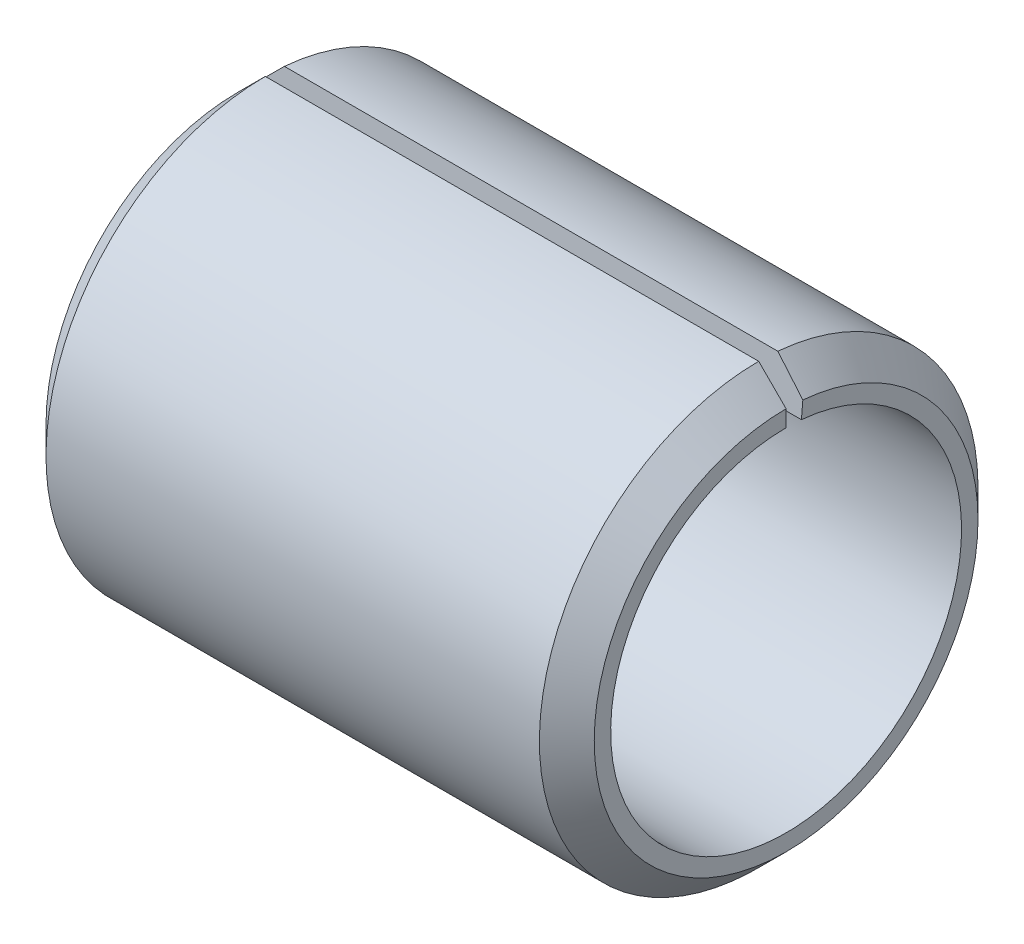
ISO-10303-21;
HEADER;
FILE_DESCRIPTION(('STEP AP214'),'2;1');
FILE_NAME('part.step','',(''),(''),'','','');
FILE_SCHEMA(('AUTOMOTIVE_DESIGN { 1 0 10303 214 1 1 1 1 }'));
ENDSEC;
DATA;
#1=APPLICATION_CONTEXT('core data for automotive mechanical design processes');
#2=APPLICATION_PROTOCOL_DEFINITION('international standard','automotive_design',2000,#1);
#3=PRODUCT_CONTEXT('',#1,'mechanical');
#4=PRODUCT('Part','Part','',(#3));
#5=PRODUCT_RELATED_PRODUCT_CATEGORY('part','',(#4));
#6=PRODUCT_DEFINITION_FORMATION('','',#4);
#7=PRODUCT_DEFINITION_CONTEXT('part definition',#1,'design');
#8=PRODUCT_DEFINITION('design','',#6,#7);
#9=PRODUCT_DEFINITION_SHAPE('','',#8);
#10=(LENGTH_UNIT() NAMED_UNIT(*) SI_UNIT(.MILLI.,.METRE.));
#11=(NAMED_UNIT(*) PLANE_ANGLE_UNIT() SI_UNIT($,.RADIAN.));
#12=(NAMED_UNIT(*) SI_UNIT($,.STERADIAN.) SOLID_ANGLE_UNIT());
#13=UNCERTAINTY_MEASURE_WITH_UNIT(LENGTH_MEASURE(1.E-05),#10,'distance_accuracy_value','');
#14=(GEOMETRIC_REPRESENTATION_CONTEXT(3) GLOBAL_UNCERTAINTY_ASSIGNED_CONTEXT((#13)) GLOBAL_UNIT_ASSIGNED_CONTEXT((#10,
#11,#12)) REPRESENTATION_CONTEXT('',''));
#15=CARTESIAN_POINT('',(0.,0.,0.));
#16=DIRECTION('',(0.,0.,1.));
#17=DIRECTION('',(1.,0.,0.));
#18=AXIS2_PLACEMENT_3D('',#15,#16,#17);
#19=CARTESIAN_POINT('',(-7.53134107515052,0.,0.));
#20=DIRECTION('',(-1.,0.,0.));
#21=DIRECTION('',(0.,0.,1.));
#22=AXIS2_PLACEMENT_3D('',#19,#20,#21);
#23=CYLINDRICAL_SURFACE('',#22,3.2);
#24=CARTESIAN_POINT('',(-5.,0.,0.));
#25=DIRECTION('',(-1.,0.,0.));
#26=DIRECTION('',(0.,0.,1.));
#27=AXIS2_PLACEMENT_3D('',#24,#25,#26);
#28=CIRCLE('',#27,3.2);
#29=CARTESIAN_POINT('',(-5.,3.18782303389359,-0.278898376792464));
#30=VERTEX_POINT('',#29);
#31=CARTESIAN_POINT('',(-5.,3.2,0.));
#32=VERTEX_POINT('',#31);
#33=EDGE_CURVE('E92',#30,#32,#28,.T.);
#34=ORIENTED_EDGE('',*,*,#33,.T.);
#35=DIRECTION('',(1.,0.,0.));
#36=VECTOR('',#35,1.);
#37=CARTESIAN_POINT('',(-5.,3.2,0.));
#38=LINE('',#37,#36);
#39=CARTESIAN_POINT('',(5.,3.2,0.));
#40=VERTEX_POINT('',#39);
#41=EDGE_CURVE('E99',#32,#40,#38,.T.);
#42=ORIENTED_EDGE('',*,*,#41,.T.);
#43=CARTESIAN_POINT('',(5.,0.,0.));
#44=DIRECTION('',(-1.,0.,0.));
#45=DIRECTION('',(0.,0.,1.));
#46=AXIS2_PLACEMENT_3D('',#43,#44,#45);
#47=CIRCLE('',#46,3.2);
#48=CARTESIAN_POINT('',(5.,3.18782303389359,-0.278898376792464));
#49=VERTEX_POINT('',#48);
#50=EDGE_CURVE('E83',#49,#40,#47,.T.);
#51=ORIENTED_EDGE('',*,*,#50,.F.);
#52=DIRECTION('',(1.,0.,0.));
#53=VECTOR('',#52,1.);
#54=CARTESIAN_POINT('',(-5.,3.18782303389359,-0.278898376792464));
#55=LINE('',#54,#53);
#56=EDGE_CURVE('E111',#30,#49,#55,.T.);
#57=ORIENTED_EDGE('',*,*,#56,.F.);
#58=EDGE_LOOP('',(#34,#42,#51,#57));
#59=FACE_BOUND('',#58,.T.);
#60=ADVANCED_FACE('F31',(#59),#23,.F.);
#61=CARTESIAN_POINT('',(-5.,3.18782303389359,-0.278898376792464));
#62=DIRECTION('',(1.,0.,0.));
#63=DIRECTION('',(0.,0.,-1.));
#64=AXIS2_PLACEMENT_3D('',#61,#62,#63);
#65=PLANE('',#64);
#66=DIRECTION('',(0.,-0.996194698091747,0.087155742747645));
#67=VECTOR('',#66,1.);
#68=CARTESIAN_POINT('',(-5.,3.18782303389359,-0.278898376792464));
#69=LINE('',#68,#67);
#70=CARTESIAN_POINT('',(-5.,3.48668144332112,-0.305045099616758));
#71=VERTEX_POINT('',#70);
#72=EDGE_CURVE('E93',#71,#30,#69,.T.);
#73=ORIENTED_EDGE('',*,*,#72,.F.);
#74=CARTESIAN_POINT('',(-5.,0.,0.));
#75=DIRECTION('',(1.,0.,0.));
#76=DIRECTION('',(0.,0.,-1.));
#77=AXIS2_PLACEMENT_3D('',#74,#75,#76);
#78=CIRCLE('',#77,3.5);
#79=CARTESIAN_POINT('',(-5.,3.5,0.));
#80=VERTEX_POINT('',#79);
#81=EDGE_CURVE('E118',#71,#80,#78,.F.);
#82=ORIENTED_EDGE('',*,*,#81,.T.);
#83=DIRECTION('',(0.,-1.,0.));
#84=VECTOR('',#83,1.);
#85=CARTESIAN_POINT('',(-5.,3.2,0.));
#86=LINE('',#85,#84);
#87=EDGE_CURVE('E109',#80,#32,#86,.T.);
#88=ORIENTED_EDGE('',*,*,#87,.T.);
#89=ORIENTED_EDGE('',*,*,#33,.F.);
#90=EDGE_LOOP('',(#73,#82,#88,#89));
#91=FACE_BOUND('',#90,.T.);
#92=ADVANCED_FACE('F136',(#91),#65,.F.);
#93=CARTESIAN_POINT('',(-7.53134107515052,0.,0.));
#94=DIRECTION('',(-1.,0.,0.));
#95=DIRECTION('',(0.,0.,1.));
#96=AXIS2_PLACEMENT_3D('',#93,#94,#95);
#97=CYLINDRICAL_SURFACE('',#96,4.);
#98=DIRECTION('',(-1.,0.,0.));
#99=VECTOR('',#98,1.);
#100=CARTESIAN_POINT('',(-5.,4.,0.));
#101=LINE('',#100,#99);
#102=CARTESIAN_POINT('',(4.5,4.,0.));
#103=VERTEX_POINT('',#102);
#104=CARTESIAN_POINT('',(-4.5,4.,0.));
#105=VERTEX_POINT('',#104);
#106=EDGE_CURVE('E102',#103,#105,#101,.T.);
#107=ORIENTED_EDGE('',*,*,#106,.T.);
#108=CARTESIAN_POINT('',(-4.5,0.,0.));
#109=DIRECTION('',(1.,0.,0.));
#110=DIRECTION('',(0.,0.,-1.));
#111=AXIS2_PLACEMENT_3D('',#108,#109,#110);
#112=CIRCLE('',#111,4.);
#113=CARTESIAN_POINT('',(-4.5,3.98477879236699,-0.34862297099058));
#114=VERTEX_POINT('',#113);
#115=EDGE_CURVE('E52',#105,#114,#112,.T.);
#116=ORIENTED_EDGE('',*,*,#115,.T.);
#117=DIRECTION('',(-1.,0.,0.));
#118=VECTOR('',#117,1.);
#119=CARTESIAN_POINT('',(-5.,3.98477879236699,-0.34862297099058));
#120=LINE('',#119,#118);
#121=CARTESIAN_POINT('',(4.5,3.98477879236699,-0.34862297099058));
#122=VERTEX_POINT('',#121);
#123=EDGE_CURVE('E114',#122,#114,#120,.T.);
#124=ORIENTED_EDGE('',*,*,#123,.F.);
#125=CARTESIAN_POINT('',(4.5,0.,0.));
#126=DIRECTION('',(-1.,0.,0.));
#127=DIRECTION('',(0.,0.,1.));
#128=AXIS2_PLACEMENT_3D('',#125,#126,#127);
#129=CIRCLE('',#128,4.);
#130=EDGE_CURVE('E124',#122,#103,#129,.T.);
#131=ORIENTED_EDGE('',*,*,#130,.T.);
#132=EDGE_LOOP('',(#107,#116,#124,#131));
#133=FACE_BOUND('',#132,.T.);
#134=ADVANCED_FACE('F138',(#133),#97,.T.);
#135=CARTESIAN_POINT('',(5.,3.98477879236699,-0.34862297099058));
#136=DIRECTION('',(-1.,0.,0.));
#137=DIRECTION('',(0.,0.,1.));
#138=AXIS2_PLACEMENT_3D('',#135,#136,#137);
#139=PLANE('',#138);
#140=DIRECTION('',(0.,1.,0.));
#141=VECTOR('',#140,1.);
#142=CARTESIAN_POINT('',(5.,4.,0.));
#143=LINE('',#142,#141);
#144=CARTESIAN_POINT('',(5.,3.5,0.));
#145=VERTEX_POINT('',#144);
#146=EDGE_CURVE('E86',#40,#145,#143,.T.);
#147=ORIENTED_EDGE('',*,*,#146,.T.);
#148=CARTESIAN_POINT('',(5.,0.,0.));
#149=DIRECTION('',(-1.,0.,0.));
#150=DIRECTION('',(0.,0.,1.));
#151=AXIS2_PLACEMENT_3D('',#148,#149,#150);
#152=CIRCLE('',#151,3.5);
#153=CARTESIAN_POINT('',(5.,3.48668144332111,-0.305045099616757));
#154=VERTEX_POINT('',#153);
#155=EDGE_CURVE('E11',#145,#154,#152,.F.);
#156=ORIENTED_EDGE('',*,*,#155,.T.);
#157=DIRECTION('',(0.,0.996194698091747,-0.087155742747645));
#158=VECTOR('',#157,1.);
#159=CARTESIAN_POINT('',(5.,3.98477879236699,-0.34862297099058));
#160=LINE('',#159,#158);
#161=EDGE_CURVE('E87',#49,#154,#160,.T.);
#162=ORIENTED_EDGE('',*,*,#161,.F.);
#163=ORIENTED_EDGE('',*,*,#50,.T.);
#164=EDGE_LOOP('',(#147,#156,#162,#163));
#165=FACE_BOUND('',#164,.T.);
#166=ADVANCED_FACE('F85',(#165),#139,.F.);
#167=CARTESIAN_POINT('',(5.,3.18782303389359,-0.278898376792464));
#168=DIRECTION('',(0.,-0.087155742747645,-0.996194698091747));
#169=DIRECTION('',(-1.,0.,0.));
#170=AXIS2_PLACEMENT_3D('',#167,#168,#169);
#171=PLANE('',#170);
#172=ORIENTED_EDGE('',*,*,#123,.T.);
#173=DIRECTION('',(0.707106781186548,0.704416026402759,-0.06162841671621));
#174=VECTOR('',#173,1.);
#175=CARTESIAN_POINT('',(-8.50000000000001,0.,0.));
#176=LINE('',#175,#174);
#177=EDGE_CURVE('E39',#114,#71,#176,.F.);
#178=ORIENTED_EDGE('',*,*,#177,.T.);
#179=ORIENTED_EDGE('',*,*,#72,.T.);
#180=ORIENTED_EDGE('',*,*,#56,.T.);
#181=ORIENTED_EDGE('',*,*,#161,.T.);
#182=DIRECTION('',(0.707106781186545,-0.704416026402762,0.0616284167162103));
#183=VECTOR('',#182,1.);
#184=CARTESIAN_POINT('',(8.49999999999997,0.,0.));
#185=LINE('',#184,#183);
#186=EDGE_CURVE('E128',#154,#122,#185,.F.);
#187=ORIENTED_EDGE('',*,*,#186,.T.);
#188=EDGE_LOOP('',(#172,#178,#179,#180,#181,#187));
#189=FACE_BOUND('',#188,.T.);
#190=ADVANCED_FACE('F132',(#189),#171,.F.);
#191=CARTESIAN_POINT('',(5.,3.2,0.));
#192=DIRECTION('',(0.,0.,-1.));
#193=DIRECTION('',(-1.,0.,0.));
#194=AXIS2_PLACEMENT_3D('',#191,#192,#193);
#195=PLANE('',#194);
#196=ORIENTED_EDGE('',*,*,#87,.F.);
#197=DIRECTION('',(0.707106781186548,0.707106781186547,0.));
#198=VECTOR('',#197,1.);
#199=CARTESIAN_POINT('',(-8.50000000000001,0.,0.));
#200=LINE('',#199,#198);
#201=EDGE_CURVE('E122',#80,#105,#200,.T.);
#202=ORIENTED_EDGE('',*,*,#201,.T.);
#203=ORIENTED_EDGE('',*,*,#106,.F.);
#204=DIRECTION('',(0.707106781186545,-0.70710678118655,0.));
#205=VECTOR('',#204,1.);
#206=CARTESIAN_POINT('',(8.49999999999997,0.,0.));
#207=LINE('',#206,#205);
#208=EDGE_CURVE('E101',#103,#145,#207,.T.);
#209=ORIENTED_EDGE('',*,*,#208,.T.);
#210=ORIENTED_EDGE('',*,*,#146,.F.);
#211=ORIENTED_EDGE('',*,*,#41,.F.);
#212=EDGE_LOOP('',(#196,#202,#203,#209,#210,#211));
#213=FACE_BOUND('',#212,.T.);
#214=ADVANCED_FACE('F98',(#213),#195,.T.);
#215=CARTESIAN_POINT('',(-5.,0.,0.));
#216=DIRECTION('',(1.,0.,0.));
#217=DIRECTION('',(0.,0.,-1.));
#218=AXIS2_PLACEMENT_3D('',#215,#216,#217);
#219=CONICAL_SURFACE('',#218,3.5,0.785398163397447);
#220=ORIENTED_EDGE('',*,*,#177,.F.);
#221=ORIENTED_EDGE('',*,*,#115,.F.);
#222=ORIENTED_EDGE('',*,*,#201,.F.);
#223=ORIENTED_EDGE('',*,*,#81,.F.);
#224=EDGE_LOOP('',(#220,#221,#222,#223));
#225=FACE_BOUND('',#224,.T.);
#226=ADVANCED_FACE('F137',(#225),#219,.T.);
#227=CARTESIAN_POINT('',(4.5,0.,0.));
#228=DIRECTION('',(-1.,0.,0.));
#229=DIRECTION('',(0.,0.,1.));
#230=AXIS2_PLACEMENT_3D('',#227,#228,#229);
#231=CONICAL_SURFACE('',#230,4.,0.785398163397452);
#232=ORIENTED_EDGE('',*,*,#186,.F.);
#233=ORIENTED_EDGE('',*,*,#155,.F.);
#234=ORIENTED_EDGE('',*,*,#208,.F.);
#235=ORIENTED_EDGE('',*,*,#130,.F.);
#236=EDGE_LOOP('',(#232,#233,#234,#235));
#237=FACE_BOUND('',#236,.T.);
#238=ADVANCED_FACE('F33',(#237),#231,.T.);
#239=CLOSED_SHELL('',(#60,#92,#134,#166,#190,#214,#226,#238));
#240=MANIFOLD_SOLID_BREP('B2',#239);
#241=ADVANCED_BREP_SHAPE_REPRESENTATION('',(#18,#240),#14);
#242=SHAPE_DEFINITION_REPRESENTATION(#9,#241);
ENDSEC;
END-ISO-10303-21;
